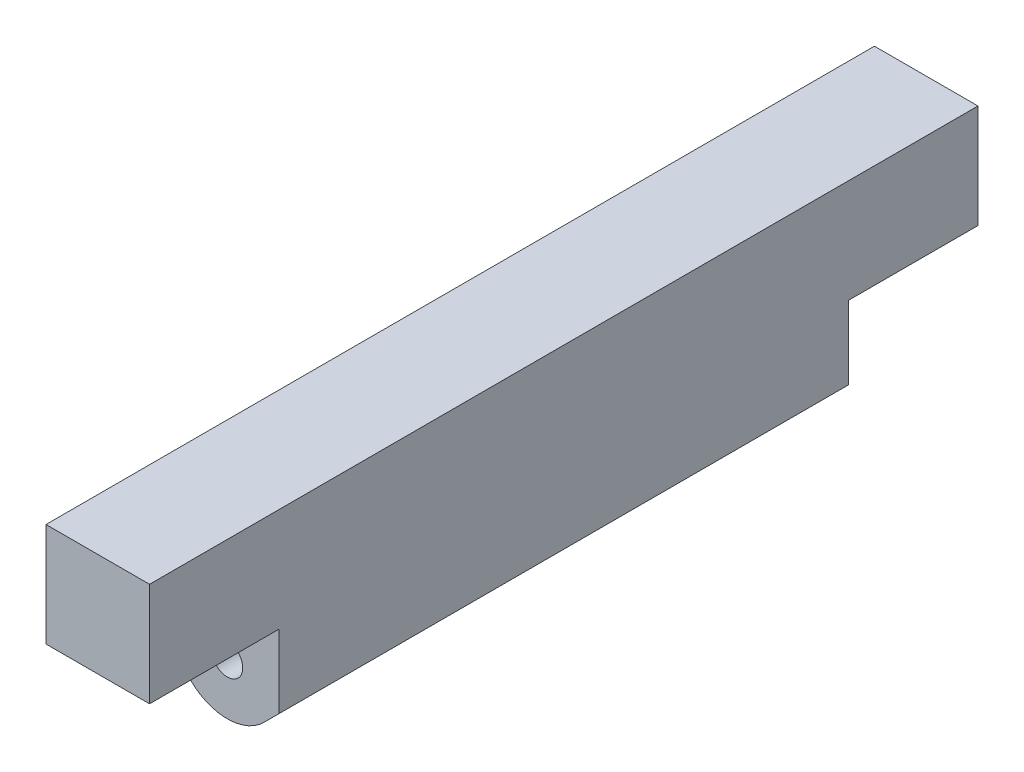
ISO-10303-21;
HEADER;
FILE_DESCRIPTION(('STEP AP214'),'2;1');
FILE_NAME('part.step','',(''),(''),'','','');
FILE_SCHEMA(('AUTOMOTIVE_DESIGN { 1 0 10303 214 1 1 1 1 }'));
ENDSEC;
DATA;
#1=APPLICATION_CONTEXT('core data for automotive mechanical design processes');
#2=APPLICATION_PROTOCOL_DEFINITION('international standard','automotive_design',2000,#1);
#3=PRODUCT_CONTEXT('',#1,'mechanical');
#4=PRODUCT('Part','Part','',(#3));
#5=PRODUCT_RELATED_PRODUCT_CATEGORY('part','',(#4));
#6=PRODUCT_DEFINITION_FORMATION('','',#4);
#7=PRODUCT_DEFINITION_CONTEXT('part definition',#1,'design');
#8=PRODUCT_DEFINITION('design','',#6,#7);
#9=PRODUCT_DEFINITION_SHAPE('','',#8);
#10=(LENGTH_UNIT() NAMED_UNIT(*) SI_UNIT(.MILLI.,.METRE.));
#11=(NAMED_UNIT(*) PLANE_ANGLE_UNIT() SI_UNIT($,.RADIAN.));
#12=(NAMED_UNIT(*) SI_UNIT($,.STERADIAN.) SOLID_ANGLE_UNIT());
#13=UNCERTAINTY_MEASURE_WITH_UNIT(LENGTH_MEASURE(1.E-05),#10,'distance_accuracy_value','');
#14=(GEOMETRIC_REPRESENTATION_CONTEXT(3) GLOBAL_UNCERTAINTY_ASSIGNED_CONTEXT((#13)) GLOBAL_UNIT_ASSIGNED_CONTEXT((#10,
#11,#12)) REPRESENTATION_CONTEXT('',''));
#15=CARTESIAN_POINT('',(0.,0.,0.));
#16=DIRECTION('',(0.,0.,1.));
#17=DIRECTION('',(1.,0.,0.));
#18=AXIS2_PLACEMENT_3D('',#15,#16,#17);
#19=CARTESIAN_POINT('',(0.,0.,27.5));
#20=DIRECTION('',(0.,0.,-1.));
#21=DIRECTION('',(-1.,0.,0.));
#22=AXIS2_PLACEMENT_3D('',#19,#20,#21);
#23=PLANE('',#22);
#24=CARTESIAN_POINT('',(0.,-2.5,27.5));
#25=DIRECTION('',(0.,0.,-1.));
#26=DIRECTION('',(-1.,0.,0.));
#27=AXIS2_PLACEMENT_3D('',#24,#25,#26);
#28=CIRCLE('',#27,0.75);
#29=CARTESIAN_POINT('',(-0.75,-2.5,27.5));
#30=VERTEX_POINT('',#29);
#31=EDGE_CURVE('E225',#30,#30,#28,.T.);
#32=ORIENTED_EDGE('',*,*,#31,.T.);
#33=EDGE_LOOP('',(#32));
#34=FACE_BOUND('',#33,.T.);
#35=DIRECTION('',(0.707106781186544,-0.707106781186551,0.));
#36=VECTOR('',#35,1.);
#37=CARTESIAN_POINT('',(-3.01776695296638,-3.01776695296635,27.5));
#38=LINE('',#37,#36);
#39=CARTESIAN_POINT('',(-2.5,-3.53553390593273,27.5));
#40=VERTEX_POINT('',#39);
#41=CARTESIAN_POINT('',(-1.76776695296638,-4.26776695296636,27.5));
#42=VERTEX_POINT('',#41);
#43=EDGE_CURVE('E141',#40,#42,#38,.T.);
#44=ORIENTED_EDGE('',*,*,#43,.T.);
#45=CARTESIAN_POINT('',(0.,-2.5,27.5));
#46=DIRECTION('',(0.,0.,-1.));
#47=DIRECTION('',(-1.,0.,0.));
#48=AXIS2_PLACEMENT_3D('',#45,#46,#47);
#49=CIRCLE('',#48,2.5);
#50=CARTESIAN_POINT('',(1.76776695296638,-4.26776695296636,27.5));
#51=VERTEX_POINT('',#50);
#52=EDGE_CURVE('E232',#42,#51,#49,.F.);
#53=ORIENTED_EDGE('',*,*,#52,.T.);
#54=DIRECTION('',(-0.707106781186544,-0.707106781186551,0.));
#55=VECTOR('',#54,1.);
#56=CARTESIAN_POINT('',(3.01776695296638,-3.01776695296635,27.5));
#57=LINE('',#56,#55);
#58=CARTESIAN_POINT('',(2.5,-3.53553390593273,27.5));
#59=VERTEX_POINT('',#58);
#60=EDGE_CURVE('E228',#59,#51,#57,.T.);
#61=ORIENTED_EDGE('',*,*,#60,.F.);
#62=DIRECTION('',(0.,1.,0.));
#63=VECTOR('',#62,1.);
#64=CARTESIAN_POINT('',(2.5,-5.,27.5));
#65=LINE('',#64,#63);
#66=CARTESIAN_POINT('',(2.5,0.,27.5));
#67=VERTEX_POINT('',#66);
#68=EDGE_CURVE('E78',#59,#67,#65,.T.);
#69=ORIENTED_EDGE('',*,*,#68,.T.);
#70=DIRECTION('',(1.,0.,0.));
#71=VECTOR('',#70,1.);
#72=CARTESIAN_POINT('',(0.,0.,27.5));
#73=LINE('',#72,#71);
#74=CARTESIAN_POINT('',(-2.5,0.,27.5));
#75=VERTEX_POINT('',#74);
#76=EDGE_CURVE('E73',#75,#67,#73,.T.);
#77=ORIENTED_EDGE('',*,*,#76,.F.);
#78=DIRECTION('',(0.,-1.,0.));
#79=VECTOR('',#78,1.);
#80=CARTESIAN_POINT('',(-2.5,-5.,27.5));
#81=LINE('',#80,#79);
#82=EDGE_CURVE('E161',#75,#40,#81,.T.);
#83=ORIENTED_EDGE('',*,*,#82,.T.);
#84=EDGE_LOOP('',(#44,#53,#61,#69,#77,#83));
#85=FACE_BOUND('',#84,.T.);
#86=ADVANCED_FACE('F58',(#34,#85),#23,.F.);
#87=CARTESIAN_POINT('',(0.,0.,0.));
#88=DIRECTION('',(0.,0.,-1.));
#89=DIRECTION('',(-1.,0.,0.));
#90=AXIS2_PLACEMENT_3D('',#87,#88,#89);
#91=PLANE('',#90);
#92=CARTESIAN_POINT('',(0.,-2.5,0.));
#93=DIRECTION('',(0.,0.,-1.));
#94=DIRECTION('',(-1.,0.,0.));
#95=AXIS2_PLACEMENT_3D('',#92,#93,#94);
#96=CIRCLE('',#95,0.75);
#97=CARTESIAN_POINT('',(-0.75,-2.5,0.));
#98=VERTEX_POINT('',#97);
#99=EDGE_CURVE('E217',#98,#98,#96,.T.);
#100=ORIENTED_EDGE('',*,*,#99,.F.);
#101=EDGE_LOOP('',(#100));
#102=FACE_BOUND('',#101,.T.);
#103=CARTESIAN_POINT('',(0.,-2.5,0.));
#104=DIRECTION('',(0.,0.,-1.));
#105=DIRECTION('',(-1.,0.,0.));
#106=AXIS2_PLACEMENT_3D('',#103,#104,#105);
#107=CIRCLE('',#106,2.5);
#108=CARTESIAN_POINT('',(1.76776695296638,-4.26776695296636,0.));
#109=VERTEX_POINT('',#108);
#110=CARTESIAN_POINT('',(-1.76776695296638,-4.26776695296636,0.));
#111=VERTEX_POINT('',#110);
#112=EDGE_CURVE('E152',#109,#111,#107,.T.);
#113=ORIENTED_EDGE('',*,*,#112,.T.);
#114=DIRECTION('',(-0.707106781186544,0.707106781186551,0.));
#115=VECTOR('',#114,1.);
#116=CARTESIAN_POINT('',(-3.01776695296638,-3.01776695296635,0.));
#117=LINE('',#116,#115);
#118=CARTESIAN_POINT('',(-2.5,-3.53553390593273,0.));
#119=VERTEX_POINT('',#118);
#120=EDGE_CURVE('E139',#111,#119,#117,.T.);
#121=ORIENTED_EDGE('',*,*,#120,.T.);
#122=DIRECTION('',(0.,-1.,0.));
#123=VECTOR('',#122,1.);
#124=CARTESIAN_POINT('',(-2.5,-5.,0.));
#125=LINE('',#124,#123);
#126=CARTESIAN_POINT('',(-2.5,0.,0.));
#127=VERTEX_POINT('',#126);
#128=EDGE_CURVE('E149',#127,#119,#125,.T.);
#129=ORIENTED_EDGE('',*,*,#128,.F.);
#130=DIRECTION('',(1.,0.,0.));
#131=VECTOR('',#130,1.);
#132=CARTESIAN_POINT('',(0.,0.,0.));
#133=LINE('',#132,#131);
#134=CARTESIAN_POINT('',(2.5,0.,0.));
#135=VERTEX_POINT('',#134);
#136=EDGE_CURVE('E12',#127,#135,#133,.T.);
#137=ORIENTED_EDGE('',*,*,#136,.T.);
#138=DIRECTION('',(0.,1.,0.));
#139=VECTOR('',#138,1.);
#140=CARTESIAN_POINT('',(2.5,-5.,0.));
#141=LINE('',#140,#139);
#142=CARTESIAN_POINT('',(2.5,-3.53553390593273,0.));
#143=VERTEX_POINT('',#142);
#144=EDGE_CURVE('E159',#143,#135,#141,.T.);
#145=ORIENTED_EDGE('',*,*,#144,.F.);
#146=DIRECTION('',(0.707106781186544,0.707106781186551,0.));
#147=VECTOR('',#146,1.);
#148=CARTESIAN_POINT('',(3.01776695296638,-3.01776695296635,0.));
#149=LINE('',#148,#147);
#150=EDGE_CURVE('E236',#109,#143,#149,.T.);
#151=ORIENTED_EDGE('',*,*,#150,.F.);
#152=EDGE_LOOP('',(#113,#121,#129,#137,#145,#151));
#153=FACE_BOUND('',#152,.T.);
#154=ADVANCED_FACE('F148',(#102,#153),#91,.T.);
#155=CARTESIAN_POINT('',(-2.5,-5.,27.5));
#156=DIRECTION('',(1.,0.,0.));
#157=DIRECTION('',(0.,0.,-1.));
#158=AXIS2_PLACEMENT_3D('',#155,#156,#157);
#159=PLANE('',#158);
#160=DIRECTION('',(0.,0.,-1.));
#161=VECTOR('',#160,1.);
#162=CARTESIAN_POINT('',(-2.5,-3.53553390593273,30.3973541275917));
#163=LINE('',#162,#161);
#164=EDGE_CURVE('E135',#40,#119,#163,.T.);
#165=ORIENTED_EDGE('',*,*,#164,.F.);
#166=ORIENTED_EDGE('',*,*,#82,.F.);
#167=DIRECTION('',(0.,0.,-1.));
#168=VECTOR('',#167,1.);
#169=CARTESIAN_POINT('',(-2.5,0.,33.75));
#170=LINE('',#169,#168);
#171=CARTESIAN_POINT('',(-2.5,0.,33.75));
#172=VERTEX_POINT('',#171);
#173=EDGE_CURVE('E201',#172,#75,#170,.T.);
#174=ORIENTED_EDGE('',*,*,#173,.F.);
#175=DIRECTION('',(0.,-1.,0.));
#176=VECTOR('',#175,1.);
#177=CARTESIAN_POINT('',(-2.5,0.,33.75));
#178=LINE('',#177,#176);
#179=CARTESIAN_POINT('',(-2.5,5.,33.75));
#180=VERTEX_POINT('',#179);
#181=EDGE_CURVE('E191',#180,#172,#178,.T.);
#182=ORIENTED_EDGE('',*,*,#181,.F.);
#183=DIRECTION('',(0.,0.,-1.));
#184=VECTOR('',#183,1.);
#185=CARTESIAN_POINT('',(-2.5,5.,27.5));
#186=LINE('',#185,#184);
#187=CARTESIAN_POINT('',(-2.5,5.,-6.25));
#188=VERTEX_POINT('',#187);
#189=EDGE_CURVE('E166',#180,#188,#186,.T.);
#190=ORIENTED_EDGE('',*,*,#189,.T.);
#191=DIRECTION('',(0.,-1.,0.));
#192=VECTOR('',#191,1.);
#193=CARTESIAN_POINT('',(-2.5,0.,-6.25));
#194=LINE('',#193,#192);
#195=CARTESIAN_POINT('',(-2.5,0.,-6.25));
#196=VERTEX_POINT('',#195);
#197=EDGE_CURVE('E190',#188,#196,#194,.T.);
#198=ORIENTED_EDGE('',*,*,#197,.T.);
#199=EDGE_CURVE('E158',#127,#196,#170,.T.);
#200=ORIENTED_EDGE('',*,*,#199,.F.);
#201=ORIENTED_EDGE('',*,*,#128,.T.);
#202=EDGE_LOOP('',(#165,#166,#174,#182,#190,#198,#200,#201));
#203=FACE_BOUND('',#202,.T.);
#204=ADVANCED_FACE('F156',(#203),#159,.F.);
#205=CARTESIAN_POINT('',(2.5,-5.,27.5));
#206=DIRECTION('',(-1.,0.,0.));
#207=DIRECTION('',(0.,0.,1.));
#208=AXIS2_PLACEMENT_3D('',#205,#206,#207);
#209=PLANE('',#208);
#210=ORIENTED_EDGE('',*,*,#68,.F.);
#211=DIRECTION('',(0.,0.,-1.));
#212=VECTOR('',#211,1.);
#213=CARTESIAN_POINT('',(2.5,-3.53553390593273,30.3973541275917));
#214=LINE('',#213,#212);
#215=EDGE_CURVE('E235',#59,#143,#214,.T.);
#216=ORIENTED_EDGE('',*,*,#215,.T.);
#217=ORIENTED_EDGE('',*,*,#144,.T.);
#218=DIRECTION('',(0.,0.,-1.));
#219=VECTOR('',#218,1.);
#220=CARTESIAN_POINT('',(2.5,0.,33.75));
#221=LINE('',#220,#219);
#222=CARTESIAN_POINT('',(2.5,0.,-6.25));
#223=VERTEX_POINT('',#222);
#224=EDGE_CURVE('E183',#135,#223,#221,.T.);
#225=ORIENTED_EDGE('',*,*,#224,.T.);
#226=DIRECTION('',(0.,1.,0.));
#227=VECTOR('',#226,1.);
#228=CARTESIAN_POINT('',(2.5,5.,-6.25));
#229=LINE('',#228,#227);
#230=CARTESIAN_POINT('',(2.5,5.,-6.25));
#231=VERTEX_POINT('',#230);
#232=EDGE_CURVE('E181',#223,#231,#229,.T.);
#233=ORIENTED_EDGE('',*,*,#232,.T.);
#234=DIRECTION('',(0.,0.,-1.));
#235=VECTOR('',#234,1.);
#236=CARTESIAN_POINT('',(2.5,5.,27.5));
#237=LINE('',#236,#235);
#238=CARTESIAN_POINT('',(2.5,5.,33.75));
#239=VERTEX_POINT('',#238);
#240=EDGE_CURVE('E66',#239,#231,#237,.T.);
#241=ORIENTED_EDGE('',*,*,#240,.F.);
#242=DIRECTION('',(0.,1.,0.));
#243=VECTOR('',#242,1.);
#244=CARTESIAN_POINT('',(2.5,5.,33.75));
#245=LINE('',#244,#243);
#246=CARTESIAN_POINT('',(2.5,0.,33.75));
#247=VERTEX_POINT('',#246);
#248=EDGE_CURVE('E211',#247,#239,#245,.T.);
#249=ORIENTED_EDGE('',*,*,#248,.F.);
#250=EDGE_CURVE('E198',#247,#67,#221,.T.);
#251=ORIENTED_EDGE('',*,*,#250,.T.);
#252=EDGE_LOOP('',(#210,#216,#217,#225,#233,#241,#249,#251));
#253=FACE_BOUND('',#252,.T.);
#254=ADVANCED_FACE('F60',(#253),#209,.F.);
#255=CARTESIAN_POINT('',(-2.5,5.,27.5));
#256=DIRECTION('',(0.,-1.,0.));
#257=DIRECTION('',(0.,0.,-1.));
#258=AXIS2_PLACEMENT_3D('',#255,#256,#257);
#259=PLANE('',#258);
#260=ORIENTED_EDGE('',*,*,#240,.T.);
#261=DIRECTION('',(-1.,0.,0.));
#262=VECTOR('',#261,1.);
#263=CARTESIAN_POINT('',(-2.5,5.,-6.25));
#264=LINE('',#263,#262);
#265=EDGE_CURVE('E173',#231,#188,#264,.T.);
#266=ORIENTED_EDGE('',*,*,#265,.T.);
#267=ORIENTED_EDGE('',*,*,#189,.F.);
#268=DIRECTION('',(-1.,0.,0.));
#269=VECTOR('',#268,1.);
#270=CARTESIAN_POINT('',(-2.5,5.,33.75));
#271=LINE('',#270,#269);
#272=EDGE_CURVE('E176',#239,#180,#271,.T.);
#273=ORIENTED_EDGE('',*,*,#272,.F.);
#274=EDGE_LOOP('',(#260,#266,#267,#273));
#275=FACE_BOUND('',#274,.T.);
#276=ADVANCED_FACE('F171',(#275),#259,.F.);
#277=CARTESIAN_POINT('',(0.,0.,-6.25));
#278=DIRECTION('',(0.,0.,-1.));
#279=DIRECTION('',(-1.,0.,0.));
#280=AXIS2_PLACEMENT_3D('',#277,#278,#279);
#281=PLANE('',#280);
#282=ORIENTED_EDGE('',*,*,#197,.F.);
#283=ORIENTED_EDGE('',*,*,#265,.F.);
#284=ORIENTED_EDGE('',*,*,#232,.F.);
#285=DIRECTION('',(1.,0.,0.));
#286=VECTOR('',#285,1.);
#287=CARTESIAN_POINT('',(2.5,0.,-6.25));
#288=LINE('',#287,#286);
#289=EDGE_CURVE('E187',#196,#223,#288,.T.);
#290=ORIENTED_EDGE('',*,*,#289,.F.);
#291=EDGE_LOOP('',(#282,#283,#284,#290));
#292=FACE_BOUND('',#291,.T.);
#293=ADVANCED_FACE('F189',(#292),#281,.T.);
#294=CARTESIAN_POINT('',(2.5,0.,33.75));
#295=DIRECTION('',(0.,1.,0.));
#296=DIRECTION('',(0.,0.,1.));
#297=AXIS2_PLACEMENT_3D('',#294,#295,#296);
#298=PLANE('',#297);
#299=ORIENTED_EDGE('',*,*,#136,.F.);
#300=ORIENTED_EDGE('',*,*,#199,.T.);
#301=ORIENTED_EDGE('',*,*,#289,.T.);
#302=ORIENTED_EDGE('',*,*,#224,.F.);
#303=EDGE_LOOP('',(#299,#300,#301,#302));
#304=FACE_BOUND('',#303,.T.);
#305=ADVANCED_FACE('F249',(#304),#298,.F.);
#306=ORIENTED_EDGE('',*,*,#173,.T.);
#307=ORIENTED_EDGE('',*,*,#76,.T.);
#308=ORIENTED_EDGE('',*,*,#250,.F.);
#309=DIRECTION('',(1.,0.,0.));
#310=VECTOR('',#309,1.);
#311=CARTESIAN_POINT('',(2.5,0.,33.75));
#312=LINE('',#311,#310);
#313=EDGE_CURVE('E194',#172,#247,#312,.T.);
#314=ORIENTED_EDGE('',*,*,#313,.F.);
#315=EDGE_LOOP('',(#306,#307,#308,#314));
#316=FACE_BOUND('',#315,.T.);
#317=ADVANCED_FACE('F208',(#316),#298,.F.);
#318=CARTESIAN_POINT('',(0.,0.,33.75));
#319=DIRECTION('',(0.,0.,-1.));
#320=DIRECTION('',(-1.,0.,0.));
#321=AXIS2_PLACEMENT_3D('',#318,#319,#320);
#322=PLANE('',#321);
#323=ORIENTED_EDGE('',*,*,#181,.T.);
#324=ORIENTED_EDGE('',*,*,#313,.T.);
#325=ORIENTED_EDGE('',*,*,#248,.T.);
#326=ORIENTED_EDGE('',*,*,#272,.T.);
#327=EDGE_LOOP('',(#323,#324,#325,#326));
#328=FACE_BOUND('',#327,.T.);
#329=ADVANCED_FACE('F213',(#328),#322,.F.);
#330=CARTESIAN_POINT('',(0.,-2.5,6.));
#331=DIRECTION('',(0.,0.,-1.));
#332=DIRECTION('',(-1.,0.,0.));
#333=AXIS2_PLACEMENT_3D('',#330,#331,#332);
#334=CYLINDRICAL_SURFACE('',#333,0.75);
#335=CARTESIAN_POINT('',(0.,-2.5,6.));
#336=DIRECTION('',(0.,0.,-1.));
#337=DIRECTION('',(-1.,0.,0.));
#338=AXIS2_PLACEMENT_3D('',#335,#336,#337);
#339=CIRCLE('',#338,0.75);
#340=CARTESIAN_POINT('',(-0.75,-2.5,6.));
#341=VERTEX_POINT('',#340);
#342=EDGE_CURVE('E214',#341,#341,#339,.T.);
#343=ORIENTED_EDGE('',*,*,#342,.F.);
#344=EDGE_LOOP('',(#343));
#345=FACE_BOUND('',#344,.T.);
#346=ORIENTED_EDGE('',*,*,#99,.T.);
#347=EDGE_LOOP('',(#346));
#348=FACE_BOUND('',#347,.T.);
#349=ADVANCED_FACE('F319',(#345,#348),#334,.F.);
#350=CARTESIAN_POINT('',(0.,-2.5,6.));
#351=DIRECTION('',(0.,0.,-1.));
#352=DIRECTION('',(-1.,0.,0.));
#353=AXIS2_PLACEMENT_3D('',#350,#351,#352);
#354=PLANE('',#353);
#355=ORIENTED_EDGE('',*,*,#342,.T.);
#356=EDGE_LOOP('',(#355));
#357=FACE_BOUND('',#356,.T.);
#358=ADVANCED_FACE('F309',(#357),#354,.T.);
#359=CARTESIAN_POINT('',(0.,-2.5,21.5));
#360=DIRECTION('',(0.,0.,1.));
#361=DIRECTION('',(1.,0.,0.));
#362=AXIS2_PLACEMENT_3D('',#359,#360,#361);
#363=CYLINDRICAL_SURFACE('',#362,0.75);
#364=CARTESIAN_POINT('',(0.,-2.5,21.5));
#365=DIRECTION('',(0.,0.,-1.));
#366=DIRECTION('',(-1.,0.,0.));
#367=AXIS2_PLACEMENT_3D('',#364,#365,#366);
#368=CIRCLE('',#367,0.75);
#369=CARTESIAN_POINT('',(-0.75,-2.5,21.5));
#370=VERTEX_POINT('',#369);
#371=EDGE_CURVE('E223',#370,#370,#368,.T.);
#372=ORIENTED_EDGE('',*,*,#371,.T.);
#373=EDGE_LOOP('',(#372));
#374=FACE_BOUND('',#373,.T.);
#375=ORIENTED_EDGE('',*,*,#31,.F.);
#376=EDGE_LOOP('',(#375));
#377=FACE_BOUND('',#376,.T.);
#378=ADVANCED_FACE('F297',(#374,#377),#363,.F.);
#379=CARTESIAN_POINT('',(0.,-2.5,21.5));
#380=DIRECTION('',(0.,0.,1.));
#381=DIRECTION('',(-1.,0.,0.));
#382=AXIS2_PLACEMENT_3D('',#379,#380,#381);
#383=PLANE('',#382);
#384=ORIENTED_EDGE('',*,*,#371,.F.);
#385=EDGE_LOOP('',(#384));
#386=FACE_BOUND('',#385,.T.);
#387=ADVANCED_FACE('F292',(#386),#383,.T.);
#388=CARTESIAN_POINT('',(0.,-2.5,30.3973541275917));
#389=DIRECTION('',(0.,0.,-1.));
#390=DIRECTION('',(-1.,0.,0.));
#391=AXIS2_PLACEMENT_3D('',#388,#389,#390);
#392=CYLINDRICAL_SURFACE('',#391,2.5);
#393=ORIENTED_EDGE('',*,*,#52,.F.);
#394=DIRECTION('',(0.,0.,-1.));
#395=VECTOR('',#394,1.);
#396=CARTESIAN_POINT('',(-1.76776695296638,-4.26776695296636,30.3973541275917));
#397=LINE('',#396,#395);
#398=EDGE_CURVE('E144',#42,#111,#397,.T.);
#399=ORIENTED_EDGE('',*,*,#398,.T.);
#400=ORIENTED_EDGE('',*,*,#112,.F.);
#401=DIRECTION('',(0.,0.,-1.));
#402=VECTOR('',#401,1.);
#403=CARTESIAN_POINT('',(1.76776695296638,-4.26776695296636,30.3973541275917));
#404=LINE('',#403,#402);
#405=EDGE_CURVE('E233',#51,#109,#404,.T.);
#406=ORIENTED_EDGE('',*,*,#405,.F.);
#407=EDGE_LOOP('',(#393,#399,#400,#406));
#408=FACE_BOUND('',#407,.T.);
#409=ADVANCED_FACE('F244',(#408),#392,.T.);
#410=CARTESIAN_POINT('',(3.01776695296638,-3.01776695296635,30.3973541275917));
#411=DIRECTION('',(-0.707106781186551,0.707106781186544,0.));
#412=DIRECTION('',(-0.707106781186544,-0.707106781186551,0.));
#413=AXIS2_PLACEMENT_3D('',#410,#411,#412);
#414=PLANE('',#413);
#415=ORIENTED_EDGE('',*,*,#60,.T.);
#416=ORIENTED_EDGE('',*,*,#405,.T.);
#417=ORIENTED_EDGE('',*,*,#150,.T.);
#418=ORIENTED_EDGE('',*,*,#215,.F.);
#419=EDGE_LOOP('',(#415,#416,#417,#418));
#420=FACE_BOUND('',#419,.T.);
#421=ADVANCED_FACE('F371',(#420),#414,.F.);
#422=CARTESIAN_POINT('',(-3.01776695296638,-3.01776695296635,30.3973541275917));
#423=DIRECTION('',(-0.707106781186551,-0.707106781186544,0.));
#424=DIRECTION('',(0.707106781186544,-0.707106781186551,0.));
#425=AXIS2_PLACEMENT_3D('',#422,#423,#424);
#426=PLANE('',#425);
#427=ORIENTED_EDGE('',*,*,#164,.T.);
#428=ORIENTED_EDGE('',*,*,#120,.F.);
#429=ORIENTED_EDGE('',*,*,#398,.F.);
#430=ORIENTED_EDGE('',*,*,#43,.F.);
#431=EDGE_LOOP('',(#427,#428,#429,#430));
#432=FACE_BOUND('',#431,.T.);
#433=ADVANCED_FACE('F137',(#432),#426,.T.);
#434=CLOSED_SHELL('',(#86,#154,#204,#254,#276,#293,#305,#317,#329,#349,#358,#378,#387,#409,#421,#433));
#435=MANIFOLD_SOLID_BREP('B2',#434);
#436=ADVANCED_BREP_SHAPE_REPRESENTATION('',(#18,#435),#14);
#437=SHAPE_DEFINITION_REPRESENTATION(#9,#436);
ENDSEC;
END-ISO-10303-21;
